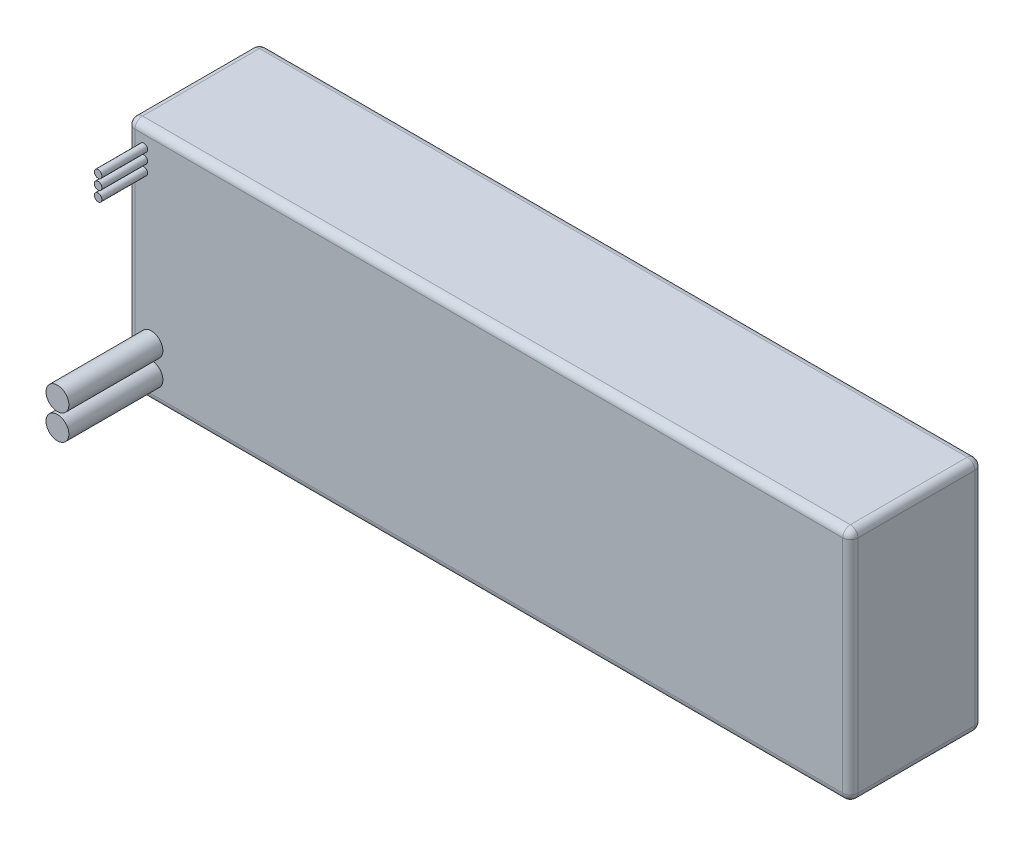
ISO-10303-21;
HEADER;
FILE_DESCRIPTION(('STEP AP214'),'2;1');
FILE_NAME('part.step','',(''),(''),'','','');
FILE_SCHEMA(('AUTOMOTIVE_DESIGN { 1 0 10303 214 1 1 1 1 }'));
ENDSEC;
DATA;
#1=APPLICATION_CONTEXT('core data for automotive mechanical design processes');
#2=APPLICATION_PROTOCOL_DEFINITION('international standard','automotive_design',2000,#1);
#3=PRODUCT_CONTEXT('',#1,'mechanical');
#4=PRODUCT('Part','Part','',(#3));
#5=PRODUCT_RELATED_PRODUCT_CATEGORY('part','',(#4));
#6=PRODUCT_DEFINITION_FORMATION('','',#4);
#7=PRODUCT_DEFINITION_CONTEXT('part definition',#1,'design');
#8=PRODUCT_DEFINITION('design','',#6,#7);
#9=PRODUCT_DEFINITION_SHAPE('','',#8);
#10=(LENGTH_UNIT() NAMED_UNIT(*) SI_UNIT(.MILLI.,.METRE.));
#11=(NAMED_UNIT(*) PLANE_ANGLE_UNIT() SI_UNIT($,.RADIAN.));
#12=(NAMED_UNIT(*) SI_UNIT($,.STERADIAN.) SOLID_ANGLE_UNIT());
#13=UNCERTAINTY_MEASURE_WITH_UNIT(LENGTH_MEASURE(1.E-05),#10,'distance_accuracy_value','');
#14=(GEOMETRIC_REPRESENTATION_CONTEXT(3) GLOBAL_UNCERTAINTY_ASSIGNED_CONTEXT((#13)) GLOBAL_UNIT_ASSIGNED_CONTEXT((#10,
#11,#12)) REPRESENTATION_CONTEXT('',''));
#15=CARTESIAN_POINT('',(0.,0.,0.));
#16=DIRECTION('',(0.,0.,1.));
#17=DIRECTION('',(1.,0.,0.));
#18=AXIS2_PLACEMENT_3D('',#15,#16,#17);
#19=CARTESIAN_POINT('',(-71.15,-23.25,-13.));
#20=DIRECTION('',(-1.,0.,0.));
#21=DIRECTION('',(0.,0.,1.));
#22=AXIS2_PLACEMENT_3D('',#19,#20,#21);
#23=PLANE('',#22);
#24=DIRECTION('',(0.,0.,1.));
#25=VECTOR('',#24,1.);
#26=CARTESIAN_POINT('',(-71.15,21.75,-13.));
#27=LINE('',#26,#25);
#28=CARTESIAN_POINT('',(-71.15,21.75,11.5));
#29=VERTEX_POINT('',#28);
#30=CARTESIAN_POINT('',(-71.15,21.75,-11.5));
#31=VERTEX_POINT('',#30);
#32=EDGE_CURVE('E136',#29,#31,#27,.F.);
#33=ORIENTED_EDGE('',*,*,#32,.T.);
#34=DIRECTION('',(0.,-1.,0.));
#35=VECTOR('',#34,1.);
#36=CARTESIAN_POINT('',(-71.15,-23.25,-11.5));
#37=LINE('',#36,#35);
#38=CARTESIAN_POINT('',(-71.15,-21.75,-11.5));
#39=VERTEX_POINT('',#38);
#40=EDGE_CURVE('E132',#31,#39,#37,.T.);
#41=ORIENTED_EDGE('',*,*,#40,.T.);
#42=DIRECTION('',(0.,0.,1.));
#43=VECTOR('',#42,1.);
#44=CARTESIAN_POINT('',(-71.15,-21.75,-13.));
#45=LINE('',#44,#43);
#46=CARTESIAN_POINT('',(-71.15,-21.75,11.5));
#47=VERTEX_POINT('',#46);
#48=EDGE_CURVE('E127',#39,#47,#45,.T.);
#49=ORIENTED_EDGE('',*,*,#48,.T.);
#50=DIRECTION('',(0.,-1.,0.));
#51=VECTOR('',#50,1.);
#52=CARTESIAN_POINT('',(-71.15,23.25,11.5));
#53=LINE('',#52,#51);
#54=EDGE_CURVE('E129',#47,#29,#53,.F.);
#55=ORIENTED_EDGE('',*,*,#54,.T.);
#56=EDGE_LOOP('',(#33,#41,#49,#55));
#57=FACE_BOUND('',#56,.T.);
#58=ADVANCED_FACE('F39',(#57),#23,.T.);
#59=CARTESIAN_POINT('',(-71.15,23.25,-13.));
#60=DIRECTION('',(0.,1.,0.));
#61=DIRECTION('',(0.,0.,1.));
#62=AXIS2_PLACEMENT_3D('',#59,#60,#61);
#63=PLANE('',#62);
#64=DIRECTION('',(0.,0.,1.));
#65=VECTOR('',#64,1.);
#66=CARTESIAN_POINT('',(69.65,23.25,-13.));
#67=LINE('',#66,#65);
#68=CARTESIAN_POINT('',(69.65,23.25,11.5));
#69=VERTEX_POINT('',#68);
#70=CARTESIAN_POINT('',(69.65,23.25,-11.5));
#71=VERTEX_POINT('',#70);
#72=EDGE_CURVE('E394',#69,#71,#67,.F.);
#73=ORIENTED_EDGE('',*,*,#72,.T.);
#74=DIRECTION('',(-1.,0.,0.));
#75=VECTOR('',#74,1.);
#76=CARTESIAN_POINT('',(-71.15,23.25,-11.5));
#77=LINE('',#76,#75);
#78=CARTESIAN_POINT('',(-69.65,23.25,-11.5));
#79=VERTEX_POINT('',#78);
#80=EDGE_CURVE('E396',#71,#79,#77,.T.);
#81=ORIENTED_EDGE('',*,*,#80,.T.);
#82=DIRECTION('',(0.,0.,1.));
#83=VECTOR('',#82,1.);
#84=CARTESIAN_POINT('',(-69.65,23.25,-13.));
#85=LINE('',#84,#83);
#86=CARTESIAN_POINT('',(-69.65,23.25,11.5));
#87=VERTEX_POINT('',#86);
#88=EDGE_CURVE('E392',#79,#87,#85,.T.);
#89=ORIENTED_EDGE('',*,*,#88,.T.);
#90=DIRECTION('',(-1.,0.,0.));
#91=VECTOR('',#90,1.);
#92=CARTESIAN_POINT('',(71.15,23.25,11.5));
#93=LINE('',#92,#91);
#94=EDGE_CURVE('E390',#87,#69,#93,.F.);
#95=ORIENTED_EDGE('',*,*,#94,.T.);
#96=EDGE_LOOP('',(#73,#81,#89,#95));
#97=FACE_BOUND('',#96,.T.);
#98=ADVANCED_FACE('F248',(#97),#63,.T.);
#99=CARTESIAN_POINT('',(71.15,-23.25,-13.));
#100=DIRECTION('',(1.,0.,0.));
#101=DIRECTION('',(0.,0.,-1.));
#102=AXIS2_PLACEMENT_3D('',#99,#100,#101);
#103=PLANE('',#102);
#104=DIRECTION('',(0.,0.,1.));
#105=VECTOR('',#104,1.);
#106=CARTESIAN_POINT('',(71.15,-21.75,-13.));
#107=LINE('',#106,#105);
#108=CARTESIAN_POINT('',(71.15,-21.75,11.5));
#109=VERTEX_POINT('',#108);
#110=CARTESIAN_POINT('',(71.15,-21.75,-11.5));
#111=VERTEX_POINT('',#110);
#112=EDGE_CURVE('E385',#109,#111,#107,.F.);
#113=ORIENTED_EDGE('',*,*,#112,.T.);
#114=DIRECTION('',(0.,1.,0.));
#115=VECTOR('',#114,1.);
#116=CARTESIAN_POINT('',(71.15,-23.25,-11.5));
#117=LINE('',#116,#115);
#118=CARTESIAN_POINT('',(71.15,21.75,-11.5));
#119=VERTEX_POINT('',#118);
#120=EDGE_CURVE('E387',#111,#119,#117,.T.);
#121=ORIENTED_EDGE('',*,*,#120,.T.);
#122=DIRECTION('',(0.,0.,1.));
#123=VECTOR('',#122,1.);
#124=CARTESIAN_POINT('',(71.15,21.75,-13.));
#125=LINE('',#124,#123);
#126=CARTESIAN_POINT('',(71.15,21.75,11.5));
#127=VERTEX_POINT('',#126);
#128=EDGE_CURVE('E383',#119,#127,#125,.T.);
#129=ORIENTED_EDGE('',*,*,#128,.T.);
#130=DIRECTION('',(0.,1.,0.));
#131=VECTOR('',#130,1.);
#132=CARTESIAN_POINT('',(71.15,-23.25,11.5));
#133=LINE('',#132,#131);
#134=EDGE_CURVE('E381',#127,#109,#133,.F.);
#135=ORIENTED_EDGE('',*,*,#134,.T.);
#136=EDGE_LOOP('',(#113,#121,#129,#135));
#137=FACE_BOUND('',#136,.T.);
#138=ADVANCED_FACE('F253',(#137),#103,.T.);
#139=CARTESIAN_POINT('',(-71.15,-23.25,-13.));
#140=DIRECTION('',(0.,-1.,0.));
#141=DIRECTION('',(0.,0.,-1.));
#142=AXIS2_PLACEMENT_3D('',#139,#140,#141);
#143=PLANE('',#142);
#144=DIRECTION('',(0.,0.,1.));
#145=VECTOR('',#144,1.);
#146=CARTESIAN_POINT('',(-69.65,-23.25,-13.));
#147=LINE('',#146,#145);
#148=CARTESIAN_POINT('',(-69.65,-23.25,11.5));
#149=VERTEX_POINT('',#148);
#150=CARTESIAN_POINT('',(-69.65,-23.25,-11.5));
#151=VERTEX_POINT('',#150);
#152=EDGE_CURVE('E158',#149,#151,#147,.F.);
#153=ORIENTED_EDGE('',*,*,#152,.T.);
#154=DIRECTION('',(1.,0.,0.));
#155=VECTOR('',#154,1.);
#156=CARTESIAN_POINT('',(-71.15,-23.25,-11.5));
#157=LINE('',#156,#155);
#158=CARTESIAN_POINT('',(69.65,-23.25,-11.5));
#159=VERTEX_POINT('',#158);
#160=EDGE_CURVE('E378',#151,#159,#157,.T.);
#161=ORIENTED_EDGE('',*,*,#160,.T.);
#162=DIRECTION('',(0.,0.,1.));
#163=VECTOR('',#162,1.);
#164=CARTESIAN_POINT('',(69.65,-23.25,-13.));
#165=LINE('',#164,#163);
#166=CARTESIAN_POINT('',(69.65,-23.25,11.5));
#167=VERTEX_POINT('',#166);
#168=EDGE_CURVE('E371',#159,#167,#165,.T.);
#169=ORIENTED_EDGE('',*,*,#168,.T.);
#170=DIRECTION('',(1.,0.,0.));
#171=VECTOR('',#170,1.);
#172=CARTESIAN_POINT('',(-71.15,-23.25,11.5));
#173=LINE('',#172,#171);
#174=EDGE_CURVE('E369',#167,#149,#173,.F.);
#175=ORIENTED_EDGE('',*,*,#174,.T.);
#176=EDGE_LOOP('',(#153,#161,#169,#175));
#177=FACE_BOUND('',#176,.T.);
#178=ADVANCED_FACE('F257',(#177),#143,.T.);
#179=CARTESIAN_POINT('',(0.,0.,-13.));
#180=DIRECTION('',(0.,0.,-1.));
#181=DIRECTION('',(-1.,0.,0.));
#182=AXIS2_PLACEMENT_3D('',#179,#180,#181);
#183=PLANE('',#182);
#184=DIRECTION('',(1.,0.,0.));
#185=VECTOR('',#184,1.);
#186=CARTESIAN_POINT('',(0.,-21.75,-13.));
#187=LINE('',#186,#185);
#188=CARTESIAN_POINT('',(69.65,-21.75,-13.));
#189=VERTEX_POINT('',#188);
#190=CARTESIAN_POINT('',(-69.65,-21.75,-13.));
#191=VERTEX_POINT('',#190);
#192=EDGE_CURVE('E366',#189,#191,#187,.F.);
#193=ORIENTED_EDGE('',*,*,#192,.T.);
#194=DIRECTION('',(0.,-1.,0.));
#195=VECTOR('',#194,1.);
#196=CARTESIAN_POINT('',(-69.65,0.,-13.));
#197=LINE('',#196,#195);
#198=CARTESIAN_POINT('',(-69.65,21.75,-13.));
#199=VERTEX_POINT('',#198);
#200=EDGE_CURVE('E364',#191,#199,#197,.F.);
#201=ORIENTED_EDGE('',*,*,#200,.T.);
#202=DIRECTION('',(-1.,0.,0.));
#203=VECTOR('',#202,1.);
#204=CARTESIAN_POINT('',(0.,21.75,-13.));
#205=LINE('',#204,#203);
#206=CARTESIAN_POINT('',(69.65,21.75,-13.));
#207=VERTEX_POINT('',#206);
#208=EDGE_CURVE('E356',#199,#207,#205,.F.);
#209=ORIENTED_EDGE('',*,*,#208,.T.);
#210=DIRECTION('',(0.,1.,0.));
#211=VECTOR('',#210,1.);
#212=CARTESIAN_POINT('',(69.65,0.,-13.));
#213=LINE('',#212,#211);
#214=EDGE_CURVE('E361',#207,#189,#213,.F.);
#215=ORIENTED_EDGE('',*,*,#214,.T.);
#216=EDGE_LOOP('',(#193,#201,#209,#215));
#217=FACE_BOUND('',#216,.T.);
#218=ADVANCED_FACE('F221',(#217),#183,.T.);
#219=CARTESIAN_POINT('',(0.,0.,13.));
#220=DIRECTION('',(0.,0.,-1.));
#221=DIRECTION('',(-1.,0.,0.));
#222=AXIS2_PLACEMENT_3D('',#219,#220,#221);
#223=PLANE('',#222);
#224=CARTESIAN_POINT('',(-67.9,15.5,13.));
#225=DIRECTION('',(0.,0.,-1.));
#226=DIRECTION('',(-1.,0.,0.));
#227=AXIS2_PLACEMENT_3D('',#224,#225,#226);
#228=CIRCLE('',#227,0.749999999999999);
#229=CARTESIAN_POINT('',(-68.65,15.5,13.));
#230=VERTEX_POINT('',#229);
#231=EDGE_CURVE('E11',#230,#230,#228,.F.);
#232=ORIENTED_EDGE('',*,*,#231,.F.);
#233=EDGE_LOOP('',(#232));
#234=FACE_BOUND('',#233,.T.);
#235=CARTESIAN_POINT('',(-67.9,17.5,13.));
#236=DIRECTION('',(0.,0.,-1.));
#237=DIRECTION('',(-1.,0.,0.));
#238=AXIS2_PLACEMENT_3D('',#235,#236,#237);
#239=CIRCLE('',#238,0.749999999999999);
#240=CARTESIAN_POINT('',(-68.65,17.5,13.));
#241=VERTEX_POINT('',#240);
#242=EDGE_CURVE('E47',#241,#241,#239,.F.);
#243=ORIENTED_EDGE('',*,*,#242,.F.);
#244=EDGE_LOOP('',(#243));
#245=FACE_BOUND('',#244,.T.);
#246=CARTESIAN_POINT('',(-67.9,19.5,13.));
#247=DIRECTION('',(0.,0.,-1.));
#248=DIRECTION('',(-1.,0.,0.));
#249=AXIS2_PLACEMENT_3D('',#246,#247,#248);
#250=CIRCLE('',#249,0.749999999999999);
#251=CARTESIAN_POINT('',(-68.65,19.5,13.));
#252=VERTEX_POINT('',#251);
#253=EDGE_CURVE('E211',#252,#252,#250,.F.);
#254=ORIENTED_EDGE('',*,*,#253,.F.);
#255=EDGE_LOOP('',(#254));
#256=FACE_BOUND('',#255,.T.);
#257=CARTESIAN_POINT('',(-66.4,-13.25,13.));
#258=DIRECTION('',(0.,0.,-1.));
#259=DIRECTION('',(-1.,0.,0.));
#260=AXIS2_PLACEMENT_3D('',#257,#258,#259);
#261=CIRCLE('',#260,2.25);
#262=CARTESIAN_POINT('',(-68.65,-13.25,13.));
#263=VERTEX_POINT('',#262);
#264=EDGE_CURVE('E207',#263,#263,#261,.F.);
#265=ORIENTED_EDGE('',*,*,#264,.F.);
#266=EDGE_LOOP('',(#265));
#267=FACE_BOUND('',#266,.T.);
#268=CARTESIAN_POINT('',(-66.4,-18.25,13.));
#269=DIRECTION('',(0.,0.,-1.));
#270=DIRECTION('',(-1.,0.,0.));
#271=AXIS2_PLACEMENT_3D('',#268,#269,#270);
#272=CIRCLE('',#271,2.25);
#273=CARTESIAN_POINT('',(-68.65,-18.25,13.));
#274=VERTEX_POINT('',#273);
#275=EDGE_CURVE('E204',#274,#274,#272,.F.);
#276=ORIENTED_EDGE('',*,*,#275,.F.);
#277=EDGE_LOOP('',(#276));
#278=FACE_BOUND('',#277,.T.);
#279=DIRECTION('',(0.,1.,0.));
#280=VECTOR('',#279,1.);
#281=CARTESIAN_POINT('',(69.65,23.25,13.));
#282=LINE('',#281,#280);
#283=CARTESIAN_POINT('',(69.65,-21.75,13.));
#284=VERTEX_POINT('',#283);
#285=CARTESIAN_POINT('',(69.65,21.75,13.));
#286=VERTEX_POINT('',#285);
#287=EDGE_CURVE('E54',#284,#286,#282,.T.);
#288=ORIENTED_EDGE('',*,*,#287,.T.);
#289=DIRECTION('',(-1.,0.,0.));
#290=VECTOR('',#289,1.);
#291=CARTESIAN_POINT('',(-71.15,21.75,13.));
#292=LINE('',#291,#290);
#293=CARTESIAN_POINT('',(-69.65,21.75,13.));
#294=VERTEX_POINT('',#293);
#295=EDGE_CURVE('E208',#286,#294,#292,.T.);
#296=ORIENTED_EDGE('',*,*,#295,.T.);
#297=DIRECTION('',(0.,-1.,0.));
#298=VECTOR('',#297,1.);
#299=CARTESIAN_POINT('',(-69.65,-23.25,13.));
#300=LINE('',#299,#298);
#301=CARTESIAN_POINT('',(-69.65,-21.75,13.));
#302=VERTEX_POINT('',#301);
#303=EDGE_CURVE('E399',#294,#302,#300,.T.);
#304=ORIENTED_EDGE('',*,*,#303,.T.);
#305=DIRECTION('',(1.,0.,0.));
#306=VECTOR('',#305,1.);
#307=CARTESIAN_POINT('',(71.15,-21.75,13.));
#308=LINE('',#307,#306);
#309=EDGE_CURVE('E59',#302,#284,#308,.T.);
#310=ORIENTED_EDGE('',*,*,#309,.T.);
#311=EDGE_LOOP('',(#288,#296,#304,#310));
#312=FACE_BOUND('',#311,.T.);
#313=ADVANCED_FACE('F218',(#234,#245,#256,#267,#278,#312),#223,.F.);
#314=CARTESIAN_POINT('',(69.65,0.,11.5));
#315=DIRECTION('',(0.,-1.,0.));
#316=DIRECTION('',(0.,0.,-1.));
#317=AXIS2_PLACEMENT_3D('',#314,#315,#316);
#318=CYLINDRICAL_SURFACE('',#317,1.5);
#319=CARTESIAN_POINT('',(69.65,21.75,11.5));
#320=DIRECTION('',(0.,1.,0.));
#321=DIRECTION('',(0.,0.,1.));
#322=AXIS2_PLACEMENT_3D('',#319,#320,#321);
#323=CIRCLE('',#322,1.5);
#324=EDGE_CURVE('E147',#286,#127,#323,.T.);
#325=ORIENTED_EDGE('',*,*,#324,.F.);
#326=ORIENTED_EDGE('',*,*,#287,.F.);
#327=CARTESIAN_POINT('',(69.65,-21.75,11.5));
#328=DIRECTION('',(0.,-1.,0.));
#329=DIRECTION('',(0.,0.,-1.));
#330=AXIS2_PLACEMENT_3D('',#327,#328,#329);
#331=CIRCLE('',#330,1.5);
#332=EDGE_CURVE('E199',#109,#284,#331,.T.);
#333=ORIENTED_EDGE('',*,*,#332,.F.);
#334=ORIENTED_EDGE('',*,*,#134,.F.);
#335=EDGE_LOOP('',(#325,#326,#333,#334));
#336=FACE_BOUND('',#335,.T.);
#337=ADVANCED_FACE('F41',(#336),#318,.T.);
#338=CARTESIAN_POINT('',(69.65,21.75,11.5));
#339=DIRECTION('',(1.,0.,0.));
#340=DIRECTION('',(0.,0.,-1.));
#341=AXIS2_PLACEMENT_3D('',#338,#339,#340);
#342=SPHERICAL_SURFACE('',#341,1.5);
#343=CARTESIAN_POINT('',(69.65,21.75,11.5));
#344=DIRECTION('',(1.,0.,0.));
#345=DIRECTION('',(0.,0.,-1.));
#346=AXIS2_PLACEMENT_3D('',#343,#344,#345);
#347=CIRCLE('',#346,1.5);
#348=EDGE_CURVE('E193',#286,#69,#347,.F.);
#349=ORIENTED_EDGE('',*,*,#348,.F.);
#350=ORIENTED_EDGE('',*,*,#324,.T.);
#351=CARTESIAN_POINT('',(69.65,21.75,11.5));
#352=DIRECTION('',(0.,0.,1.));
#353=DIRECTION('',(1.,0.,0.));
#354=AXIS2_PLACEMENT_3D('',#351,#352,#353);
#355=CIRCLE('',#354,1.5);
#356=EDGE_CURVE('E196',#69,#127,#355,.F.);
#357=ORIENTED_EDGE('',*,*,#356,.F.);
#358=EDGE_LOOP('',(#349,#350,#357));
#359=FACE_BOUND('',#358,.T.);
#360=ADVANCED_FACE('F319',(#359),#342,.T.);
#361=CARTESIAN_POINT('',(69.65,-21.75,11.5));
#362=DIRECTION('',(0.,0.,1.));
#363=DIRECTION('',(1.,0.,0.));
#364=AXIS2_PLACEMENT_3D('',#361,#362,#363);
#365=SPHERICAL_SURFACE('',#364,1.5);
#366=CARTESIAN_POINT('',(69.65,-21.75,11.5));
#367=DIRECTION('',(0.,0.,1.));
#368=DIRECTION('',(1.,0.,0.));
#369=AXIS2_PLACEMENT_3D('',#366,#367,#368);
#370=CIRCLE('',#369,1.5);
#371=EDGE_CURVE('E187',#109,#167,#370,.F.);
#372=ORIENTED_EDGE('',*,*,#371,.F.);
#373=ORIENTED_EDGE('',*,*,#332,.T.);
#374=CARTESIAN_POINT('',(69.65,-21.75,11.5));
#375=DIRECTION('',(1.,0.,0.));
#376=DIRECTION('',(0.,0.,-1.));
#377=AXIS2_PLACEMENT_3D('',#374,#375,#376);
#378=CIRCLE('',#377,1.5);
#379=EDGE_CURVE('E190',#167,#284,#378,.F.);
#380=ORIENTED_EDGE('',*,*,#379,.F.);
#381=EDGE_LOOP('',(#372,#373,#380));
#382=FACE_BOUND('',#381,.T.);
#383=ADVANCED_FACE('F316',(#382),#365,.T.);
#384=CARTESIAN_POINT('',(69.65,21.75,-13.));
#385=DIRECTION('',(0.,0.,1.));
#386=DIRECTION('',(1.,0.,0.));
#387=AXIS2_PLACEMENT_3D('',#384,#385,#386);
#388=CYLINDRICAL_SURFACE('',#387,1.5);
#389=ORIENTED_EDGE('',*,*,#356,.T.);
#390=ORIENTED_EDGE('',*,*,#128,.F.);
#391=CARTESIAN_POINT('',(69.65,21.75,-11.5));
#392=DIRECTION('',(0.,0.,-1.));
#393=DIRECTION('',(-1.,0.,0.));
#394=AXIS2_PLACEMENT_3D('',#391,#392,#393);
#395=CIRCLE('',#394,1.5);
#396=EDGE_CURVE('E182',#71,#119,#395,.T.);
#397=ORIENTED_EDGE('',*,*,#396,.F.);
#398=ORIENTED_EDGE('',*,*,#72,.F.);
#399=EDGE_LOOP('',(#389,#390,#397,#398));
#400=FACE_BOUND('',#399,.T.);
#401=ADVANCED_FACE('F312',(#400),#388,.T.);
#402=CARTESIAN_POINT('',(0.,21.75,11.5));
#403=DIRECTION('',(1.,0.,0.));
#404=DIRECTION('',(0.,0.,-1.));
#405=AXIS2_PLACEMENT_3D('',#402,#403,#404);
#406=CYLINDRICAL_SURFACE('',#405,1.5);
#407=ORIENTED_EDGE('',*,*,#348,.T.);
#408=ORIENTED_EDGE('',*,*,#94,.F.);
#409=CARTESIAN_POINT('',(-69.65,21.75,11.5));
#410=DIRECTION('',(-1.,0.,0.));
#411=DIRECTION('',(0.,0.,1.));
#412=AXIS2_PLACEMENT_3D('',#409,#410,#411);
#413=CIRCLE('',#412,1.5);
#414=EDGE_CURVE('E179',#294,#87,#413,.T.);
#415=ORIENTED_EDGE('',*,*,#414,.F.);
#416=ORIENTED_EDGE('',*,*,#295,.F.);
#417=EDGE_LOOP('',(#407,#408,#415,#416));
#418=FACE_BOUND('',#417,.T.);
#419=ADVANCED_FACE('F309',(#418),#406,.T.);
#420=CARTESIAN_POINT('',(-69.65,0.,11.5));
#421=DIRECTION('',(0.,1.,0.));
#422=DIRECTION('',(0.,0.,1.));
#423=AXIS2_PLACEMENT_3D('',#420,#421,#422);
#424=CYLINDRICAL_SURFACE('',#423,1.5);
#425=CARTESIAN_POINT('',(-69.65,-21.75,11.5));
#426=DIRECTION('',(0.,-1.,0.));
#427=DIRECTION('',(0.,0.,-1.));
#428=AXIS2_PLACEMENT_3D('',#425,#426,#427);
#429=CIRCLE('',#428,1.5);
#430=EDGE_CURVE('E143',#302,#47,#429,.T.);
#431=ORIENTED_EDGE('',*,*,#430,.F.);
#432=ORIENTED_EDGE('',*,*,#303,.F.);
#433=CARTESIAN_POINT('',(-69.65,21.75,11.5));
#434=DIRECTION('',(0.,1.,0.));
#435=DIRECTION('',(0.,0.,1.));
#436=AXIS2_PLACEMENT_3D('',#433,#434,#435);
#437=CIRCLE('',#436,1.5);
#438=EDGE_CURVE('E145',#29,#294,#437,.T.);
#439=ORIENTED_EDGE('',*,*,#438,.F.);
#440=ORIENTED_EDGE('',*,*,#54,.F.);
#441=EDGE_LOOP('',(#431,#432,#439,#440));
#442=FACE_BOUND('',#441,.T.);
#443=ADVANCED_FACE('F141',(#442),#424,.T.);
#444=CARTESIAN_POINT('',(0.,-21.75,11.5));
#445=DIRECTION('',(-1.,0.,0.));
#446=DIRECTION('',(0.,0.,1.));
#447=AXIS2_PLACEMENT_3D('',#444,#445,#446);
#448=CYLINDRICAL_SURFACE('',#447,1.5);
#449=ORIENTED_EDGE('',*,*,#379,.T.);
#450=ORIENTED_EDGE('',*,*,#309,.F.);
#451=CARTESIAN_POINT('',(-69.65,-21.75,11.5));
#452=DIRECTION('',(-1.,0.,0.));
#453=DIRECTION('',(0.,0.,1.));
#454=AXIS2_PLACEMENT_3D('',#451,#452,#453);
#455=CIRCLE('',#454,1.5);
#456=EDGE_CURVE('E155',#149,#302,#455,.T.);
#457=ORIENTED_EDGE('',*,*,#456,.F.);
#458=ORIENTED_EDGE('',*,*,#174,.F.);
#459=EDGE_LOOP('',(#449,#450,#457,#458));
#460=FACE_BOUND('',#459,.T.);
#461=ADVANCED_FACE('F302',(#460),#448,.T.);
#462=CARTESIAN_POINT('',(69.65,-21.75,-13.));
#463=DIRECTION('',(0.,0.,1.));
#464=DIRECTION('',(1.,0.,0.));
#465=AXIS2_PLACEMENT_3D('',#462,#463,#464);
#466=CYLINDRICAL_SURFACE('',#465,1.5);
#467=ORIENTED_EDGE('',*,*,#371,.T.);
#468=ORIENTED_EDGE('',*,*,#168,.F.);
#469=CARTESIAN_POINT('',(69.65,-21.75,-11.5));
#470=DIRECTION('',(0.,0.,-1.));
#471=DIRECTION('',(-1.,0.,0.));
#472=AXIS2_PLACEMENT_3D('',#469,#470,#471);
#473=CIRCLE('',#472,1.5);
#474=EDGE_CURVE('E174',#111,#159,#473,.T.);
#475=ORIENTED_EDGE('',*,*,#474,.F.);
#476=ORIENTED_EDGE('',*,*,#112,.F.);
#477=EDGE_LOOP('',(#467,#468,#475,#476));
#478=FACE_BOUND('',#477,.T.);
#479=ADVANCED_FACE('F298',(#478),#466,.T.);
#480=CARTESIAN_POINT('',(69.65,-23.25,-11.5));
#481=DIRECTION('',(0.,1.,0.));
#482=DIRECTION('',(0.,0.,1.));
#483=AXIS2_PLACEMENT_3D('',#480,#481,#482);
#484=CYLINDRICAL_SURFACE('',#483,1.5);
#485=CARTESIAN_POINT('',(69.65,21.75,-11.5));
#486=DIRECTION('',(0.,1.,0.));
#487=DIRECTION('',(0.,0.,1.));
#488=AXIS2_PLACEMENT_3D('',#485,#486,#487);
#489=CIRCLE('',#488,1.5);
#490=EDGE_CURVE('E184',#119,#207,#489,.T.);
#491=ORIENTED_EDGE('',*,*,#490,.F.);
#492=ORIENTED_EDGE('',*,*,#120,.F.);
#493=CARTESIAN_POINT('',(69.65,-21.75,-11.5));
#494=DIRECTION('',(0.,-1.,0.));
#495=DIRECTION('',(0.,0.,-1.));
#496=AXIS2_PLACEMENT_3D('',#493,#494,#495);
#497=CIRCLE('',#496,1.5);
#498=EDGE_CURVE('E171',#189,#111,#497,.T.);
#499=ORIENTED_EDGE('',*,*,#498,.F.);
#500=ORIENTED_EDGE('',*,*,#214,.F.);
#501=EDGE_LOOP('',(#491,#492,#499,#500));
#502=FACE_BOUND('',#501,.T.);
#503=ADVANCED_FACE('F294',(#502),#484,.T.);
#504=CARTESIAN_POINT('',(69.65,21.75,-11.5));
#505=DIRECTION('',(1.,0.,0.));
#506=DIRECTION('',(0.,0.,-1.));
#507=AXIS2_PLACEMENT_3D('',#504,#505,#506);
#508=SPHERICAL_SURFACE('',#507,1.5);
#509=ORIENTED_EDGE('',*,*,#396,.T.);
#510=ORIENTED_EDGE('',*,*,#490,.T.);
#511=CARTESIAN_POINT('',(69.65,21.75,-11.5));
#512=DIRECTION('',(1.,0.,0.));
#513=DIRECTION('',(0.,0.,-1.));
#514=AXIS2_PLACEMENT_3D('',#511,#512,#513);
#515=CIRCLE('',#514,1.5);
#516=EDGE_CURVE('E163',#71,#207,#515,.F.);
#517=ORIENTED_EDGE('',*,*,#516,.F.);
#518=EDGE_LOOP('',(#509,#510,#517));
#519=FACE_BOUND('',#518,.T.);
#520=ADVANCED_FACE('F290',(#519),#508,.T.);
#521=CARTESIAN_POINT('',(-69.65,21.75,11.5));
#522=DIRECTION('',(0.,0.,1.));
#523=DIRECTION('',(1.,0.,0.));
#524=AXIS2_PLACEMENT_3D('',#521,#522,#523);
#525=SPHERICAL_SURFACE('',#524,1.5);
#526=ORIENTED_EDGE('',*,*,#438,.T.);
#527=ORIENTED_EDGE('',*,*,#414,.T.);
#528=CARTESIAN_POINT('',(-69.65,21.75,11.5));
#529=DIRECTION('',(0.,0.,1.));
#530=DIRECTION('',(1.,0.,0.));
#531=AXIS2_PLACEMENT_3D('',#528,#529,#530);
#532=CIRCLE('',#531,1.5);
#533=EDGE_CURVE('E159',#29,#87,#532,.F.);
#534=ORIENTED_EDGE('',*,*,#533,.F.);
#535=EDGE_LOOP('',(#526,#527,#534));
#536=FACE_BOUND('',#535,.T.);
#537=ADVANCED_FACE('F287',(#536),#525,.T.);
#538=CARTESIAN_POINT('',(-69.65,-21.75,11.5));
#539=DIRECTION('',(0.,0.,1.));
#540=DIRECTION('',(1.,0.,0.));
#541=AXIS2_PLACEMENT_3D('',#538,#539,#540);
#542=SPHERICAL_SURFACE('',#541,1.5);
#543=ORIENTED_EDGE('',*,*,#456,.T.);
#544=ORIENTED_EDGE('',*,*,#430,.T.);
#545=CARTESIAN_POINT('',(-69.65,-21.75,11.5));
#546=DIRECTION('',(0.,0.,1.));
#547=DIRECTION('',(1.,0.,0.));
#548=AXIS2_PLACEMENT_3D('',#545,#546,#547);
#549=CIRCLE('',#548,1.5);
#550=EDGE_CURVE('E152',#149,#47,#549,.F.);
#551=ORIENTED_EDGE('',*,*,#550,.F.);
#552=EDGE_LOOP('',(#543,#544,#551));
#553=FACE_BOUND('',#552,.T.);
#554=ADVANCED_FACE('F151',(#553),#542,.T.);
#555=CARTESIAN_POINT('',(69.65,-21.75,-11.5));
#556=DIRECTION('',(1.,0.,0.));
#557=DIRECTION('',(0.,0.,-1.));
#558=AXIS2_PLACEMENT_3D('',#555,#556,#557);
#559=SPHERICAL_SURFACE('',#558,1.5);
#560=ORIENTED_EDGE('',*,*,#498,.T.);
#561=ORIENTED_EDGE('',*,*,#474,.T.);
#562=CARTESIAN_POINT('',(69.65,-21.75,-11.5));
#563=DIRECTION('',(1.,0.,0.));
#564=DIRECTION('',(0.,0.,-1.));
#565=AXIS2_PLACEMENT_3D('',#562,#563,#564);
#566=CIRCLE('',#565,1.5);
#567=EDGE_CURVE('E160',#189,#159,#566,.F.);
#568=ORIENTED_EDGE('',*,*,#567,.F.);
#569=EDGE_LOOP('',(#560,#561,#568));
#570=FACE_BOUND('',#569,.T.);
#571=ADVANCED_FACE('F280',(#570),#559,.T.);
#572=CARTESIAN_POINT('',(-71.15,21.75,-11.5));
#573=DIRECTION('',(-1.,0.,0.));
#574=DIRECTION('',(0.,0.,1.));
#575=AXIS2_PLACEMENT_3D('',#572,#573,#574);
#576=CYLINDRICAL_SURFACE('',#575,1.5);
#577=ORIENTED_EDGE('',*,*,#516,.T.);
#578=ORIENTED_EDGE('',*,*,#208,.F.);
#579=CARTESIAN_POINT('',(-69.65,21.75,-11.5));
#580=DIRECTION('',(-1.,0.,0.));
#581=DIRECTION('',(0.,0.,1.));
#582=AXIS2_PLACEMENT_3D('',#579,#580,#581);
#583=CIRCLE('',#582,1.5);
#584=EDGE_CURVE('E165',#79,#199,#583,.T.);
#585=ORIENTED_EDGE('',*,*,#584,.F.);
#586=ORIENTED_EDGE('',*,*,#80,.F.);
#587=EDGE_LOOP('',(#577,#578,#585,#586));
#588=FACE_BOUND('',#587,.T.);
#589=ADVANCED_FACE('F276',(#588),#576,.T.);
#590=CARTESIAN_POINT('',(-69.65,21.75,-13.));
#591=DIRECTION('',(0.,0.,1.));
#592=DIRECTION('',(1.,0.,0.));
#593=AXIS2_PLACEMENT_3D('',#590,#591,#592);
#594=CYLINDRICAL_SURFACE('',#593,1.5);
#595=ORIENTED_EDGE('',*,*,#533,.T.);
#596=ORIENTED_EDGE('',*,*,#88,.F.);
#597=CARTESIAN_POINT('',(-69.65,21.75,-11.5));
#598=DIRECTION('',(0.,0.,-1.));
#599=DIRECTION('',(-1.,0.,0.));
#600=AXIS2_PLACEMENT_3D('',#597,#598,#599);
#601=CIRCLE('',#600,1.5);
#602=EDGE_CURVE('E348',#31,#79,#601,.T.);
#603=ORIENTED_EDGE('',*,*,#602,.F.);
#604=ORIENTED_EDGE('',*,*,#32,.F.);
#605=EDGE_LOOP('',(#595,#596,#603,#604));
#606=FACE_BOUND('',#605,.T.);
#607=ADVANCED_FACE('F273',(#606),#594,.T.);
#608=CARTESIAN_POINT('',(-69.65,-21.75,-13.));
#609=DIRECTION('',(0.,0.,1.));
#610=DIRECTION('',(1.,0.,0.));
#611=AXIS2_PLACEMENT_3D('',#608,#609,#610);
#612=CYLINDRICAL_SURFACE('',#611,1.5);
#613=ORIENTED_EDGE('',*,*,#550,.T.);
#614=ORIENTED_EDGE('',*,*,#48,.F.);
#615=CARTESIAN_POINT('',(-69.65,-21.75,-11.5));
#616=DIRECTION('',(0.,0.,-1.));
#617=DIRECTION('',(-1.,0.,0.));
#618=AXIS2_PLACEMENT_3D('',#615,#616,#617);
#619=CIRCLE('',#618,1.5);
#620=EDGE_CURVE('E345',#151,#39,#619,.T.);
#621=ORIENTED_EDGE('',*,*,#620,.F.);
#622=ORIENTED_EDGE('',*,*,#152,.F.);
#623=EDGE_LOOP('',(#613,#614,#621,#622));
#624=FACE_BOUND('',#623,.T.);
#625=ADVANCED_FACE('F157',(#624),#612,.T.);
#626=CARTESIAN_POINT('',(-71.15,-21.75,-11.5));
#627=DIRECTION('',(1.,0.,0.));
#628=DIRECTION('',(0.,0.,-1.));
#629=AXIS2_PLACEMENT_3D('',#626,#627,#628);
#630=CYLINDRICAL_SURFACE('',#629,1.5);
#631=ORIENTED_EDGE('',*,*,#567,.T.);
#632=ORIENTED_EDGE('',*,*,#160,.F.);
#633=CARTESIAN_POINT('',(-69.65,-21.75,-11.5));
#634=DIRECTION('',(-1.,0.,0.));
#635=DIRECTION('',(0.,0.,1.));
#636=AXIS2_PLACEMENT_3D('',#633,#634,#635);
#637=CIRCLE('',#636,1.5);
#638=EDGE_CURVE('E342',#191,#151,#637,.T.);
#639=ORIENTED_EDGE('',*,*,#638,.F.);
#640=ORIENTED_EDGE('',*,*,#192,.F.);
#641=EDGE_LOOP('',(#631,#632,#639,#640));
#642=FACE_BOUND('',#641,.T.);
#643=ADVANCED_FACE('F266',(#642),#630,.T.);
#644=CARTESIAN_POINT('',(-69.65,21.75,-11.5));
#645=DIRECTION('',(0.,1.,0.));
#646=DIRECTION('',(0.,0.,1.));
#647=AXIS2_PLACEMENT_3D('',#644,#645,#646);
#648=SPHERICAL_SURFACE('',#647,1.5);
#649=ORIENTED_EDGE('',*,*,#602,.T.);
#650=ORIENTED_EDGE('',*,*,#584,.T.);
#651=CARTESIAN_POINT('',(-69.65,21.75,-11.5));
#652=DIRECTION('',(0.,1.,0.));
#653=DIRECTION('',(0.,0.,1.));
#654=AXIS2_PLACEMENT_3D('',#651,#652,#653);
#655=CIRCLE('',#654,1.5);
#656=EDGE_CURVE('E339',#31,#199,#655,.F.);
#657=ORIENTED_EDGE('',*,*,#656,.F.);
#658=EDGE_LOOP('',(#649,#650,#657));
#659=FACE_BOUND('',#658,.T.);
#660=ADVANCED_FACE('F262',(#659),#648,.T.);
#661=CARTESIAN_POINT('',(-69.65,-21.75,-11.5));
#662=DIRECTION('',(0.,-1.,0.));
#663=DIRECTION('',(0.,0.,-1.));
#664=AXIS2_PLACEMENT_3D('',#661,#662,#663);
#665=SPHERICAL_SURFACE('',#664,1.5);
#666=ORIENTED_EDGE('',*,*,#638,.T.);
#667=ORIENTED_EDGE('',*,*,#620,.T.);
#668=CARTESIAN_POINT('',(-69.65,-21.75,-11.5));
#669=DIRECTION('',(0.,-1.,0.));
#670=DIRECTION('',(0.,0.,-1.));
#671=AXIS2_PLACEMENT_3D('',#668,#669,#670);
#672=CIRCLE('',#671,1.5);
#673=EDGE_CURVE('E337',#191,#39,#672,.F.);
#674=ORIENTED_EDGE('',*,*,#673,.F.);
#675=EDGE_LOOP('',(#666,#667,#674));
#676=FACE_BOUND('',#675,.T.);
#677=ADVANCED_FACE('F243',(#676),#665,.T.);
#678=CARTESIAN_POINT('',(-69.65,-23.25,-11.5));
#679=DIRECTION('',(0.,-1.,0.));
#680=DIRECTION('',(0.,0.,-1.));
#681=AXIS2_PLACEMENT_3D('',#678,#679,#680);
#682=CYLINDRICAL_SURFACE('',#681,1.5);
#683=ORIENTED_EDGE('',*,*,#656,.T.);
#684=ORIENTED_EDGE('',*,*,#200,.F.);
#685=ORIENTED_EDGE('',*,*,#673,.T.);
#686=ORIENTED_EDGE('',*,*,#40,.F.);
#687=EDGE_LOOP('',(#683,#684,#685,#686));
#688=FACE_BOUND('',#687,.T.);
#689=ADVANCED_FACE('F233',(#688),#682,.T.);
#690=CARTESIAN_POINT('',(-66.4,-18.25,31.5));
#691=DIRECTION('',(0.,0.,-1.));
#692=DIRECTION('',(-1.,0.,0.));
#693=AXIS2_PLACEMENT_3D('',#690,#691,#692);
#694=CYLINDRICAL_SURFACE('',#693,2.25);
#695=CARTESIAN_POINT('',(-66.4,-18.25,31.5));
#696=DIRECTION('',(0.,0.,1.));
#697=DIRECTION('',(1.,0.,0.));
#698=AXIS2_PLACEMENT_3D('',#695,#696,#697);
#699=CIRCLE('',#698,2.25);
#700=CARTESIAN_POINT('',(-64.15,-18.25,31.5));
#701=VERTEX_POINT('',#700);
#702=EDGE_CURVE('E340',#701,#701,#699,.T.);
#703=ORIENTED_EDGE('',*,*,#702,.F.);
#704=EDGE_LOOP('',(#703));
#705=FACE_BOUND('',#704,.T.);
#706=ORIENTED_EDGE('',*,*,#275,.T.);
#707=EDGE_LOOP('',(#706));
#708=FACE_BOUND('',#707,.T.);
#709=ADVANCED_FACE('F230',(#705,#708),#694,.T.);
#710=CARTESIAN_POINT('',(-66.4,-18.25,31.5));
#711=DIRECTION('',(0.,0.,1.));
#712=DIRECTION('',(1.,0.,0.));
#713=AXIS2_PLACEMENT_3D('',#710,#711,#712);
#714=PLANE('',#713);
#715=ORIENTED_EDGE('',*,*,#702,.T.);
#716=EDGE_LOOP('',(#715));
#717=FACE_BOUND('',#716,.T.);
#718=ADVANCED_FACE('F232',(#717),#714,.T.);
#719=CARTESIAN_POINT('',(-66.4,-13.25,31.5));
#720=DIRECTION('',(0.,0.,-1.));
#721=DIRECTION('',(-1.,0.,0.));
#722=AXIS2_PLACEMENT_3D('',#719,#720,#721);
#723=CYLINDRICAL_SURFACE('',#722,2.25);
#724=CARTESIAN_POINT('',(-66.4,-13.25,31.5));
#725=DIRECTION('',(0.,0.,1.));
#726=DIRECTION('',(1.,0.,0.));
#727=AXIS2_PLACEMENT_3D('',#724,#725,#726);
#728=CIRCLE('',#727,2.25);
#729=CARTESIAN_POINT('',(-64.15,-13.25,31.5));
#730=VERTEX_POINT('',#729);
#731=EDGE_CURVE('E768',#730,#730,#728,.T.);
#732=ORIENTED_EDGE('',*,*,#731,.F.);
#733=EDGE_LOOP('',(#732));
#734=FACE_BOUND('',#733,.T.);
#735=ORIENTED_EDGE('',*,*,#264,.T.);
#736=EDGE_LOOP('',(#735));
#737=FACE_BOUND('',#736,.T.);
#738=ADVANCED_FACE('F240',(#734,#737),#723,.T.);
#739=CARTESIAN_POINT('',(-66.4,-13.25,31.5));
#740=DIRECTION('',(0.,0.,1.));
#741=DIRECTION('',(1.,0.,0.));
#742=AXIS2_PLACEMENT_3D('',#739,#740,#741);
#743=PLANE('',#742);
#744=ORIENTED_EDGE('',*,*,#731,.T.);
#745=EDGE_LOOP('',(#744));
#746=FACE_BOUND('',#745,.T.);
#747=ADVANCED_FACE('F602',(#746),#743,.T.);
#748=CARTESIAN_POINT('',(-67.9,19.5,22.));
#749=DIRECTION('',(0.,0.,-1.));
#750=DIRECTION('',(-1.,0.,0.));
#751=AXIS2_PLACEMENT_3D('',#748,#749,#750);
#752=CYLINDRICAL_SURFACE('',#751,0.749999999999999);
#753=CARTESIAN_POINT('',(-67.9,19.5,22.));
#754=DIRECTION('',(0.,0.,1.));
#755=DIRECTION('',(1.,0.,0.));
#756=AXIS2_PLACEMENT_3D('',#753,#754,#755);
#757=CIRCLE('',#756,0.749999999999999);
#758=CARTESIAN_POINT('',(-67.15,19.5,22.));
#759=VERTEX_POINT('',#758);
#760=EDGE_CURVE('E763',#759,#759,#757,.T.);
#761=ORIENTED_EDGE('',*,*,#760,.F.);
#762=EDGE_LOOP('',(#761));
#763=FACE_BOUND('',#762,.T.);
#764=ORIENTED_EDGE('',*,*,#253,.T.);
#765=EDGE_LOOP('',(#764));
#766=FACE_BOUND('',#765,.T.);
#767=ADVANCED_FACE('F612',(#763,#766),#752,.T.);
#768=CARTESIAN_POINT('',(-67.9,19.5,22.));
#769=DIRECTION('',(0.,0.,1.));
#770=DIRECTION('',(1.,0.,0.));
#771=AXIS2_PLACEMENT_3D('',#768,#769,#770);
#772=PLANE('',#771);
#773=ORIENTED_EDGE('',*,*,#760,.T.);
#774=EDGE_LOOP('',(#773));
#775=FACE_BOUND('',#774,.T.);
#776=ADVANCED_FACE('F622',(#775),#772,.T.);
#777=CARTESIAN_POINT('',(-67.9,17.5,22.));
#778=DIRECTION('',(0.,0.,-1.));
#779=DIRECTION('',(-1.,0.,0.));
#780=AXIS2_PLACEMENT_3D('',#777,#778,#779);
#781=CYLINDRICAL_SURFACE('',#780,0.749999999999999);
#782=CARTESIAN_POINT('',(-67.9,17.5,22.));
#783=DIRECTION('',(0.,0.,1.));
#784=DIRECTION('',(1.,0.,0.));
#785=AXIS2_PLACEMENT_3D('',#782,#783,#784);
#786=CIRCLE('',#785,0.749999999999999);
#787=CARTESIAN_POINT('',(-67.15,17.5,22.));
#788=VERTEX_POINT('',#787);
#789=EDGE_CURVE('E760',#788,#788,#786,.T.);
#790=ORIENTED_EDGE('',*,*,#789,.F.);
#791=EDGE_LOOP('',(#790));
#792=FACE_BOUND('',#791,.T.);
#793=ORIENTED_EDGE('',*,*,#242,.T.);
#794=EDGE_LOOP('',(#793));
#795=FACE_BOUND('',#794,.T.);
#796=ADVANCED_FACE('F216',(#792,#795),#781,.T.);
#797=CARTESIAN_POINT('',(-67.9,17.5,22.));
#798=DIRECTION('',(0.,0.,1.));
#799=DIRECTION('',(1.,0.,0.));
#800=AXIS2_PLACEMENT_3D('',#797,#798,#799);
#801=PLANE('',#800);
#802=ORIENTED_EDGE('',*,*,#789,.T.);
#803=EDGE_LOOP('',(#802));
#804=FACE_BOUND('',#803,.T.);
#805=ADVANCED_FACE('F641',(#804),#801,.T.);
#806=CARTESIAN_POINT('',(-67.9,15.5,22.));
#807=DIRECTION('',(0.,0.,-1.));
#808=DIRECTION('',(-1.,0.,0.));
#809=AXIS2_PLACEMENT_3D('',#806,#807,#808);
#810=CYLINDRICAL_SURFACE('',#809,0.749999999999999);
#811=CARTESIAN_POINT('',(-67.9,15.5,22.));
#812=DIRECTION('',(0.,0.,1.));
#813=DIRECTION('',(1.,0.,0.));
#814=AXIS2_PLACEMENT_3D('',#811,#812,#813);
#815=CIRCLE('',#814,0.749999999999999);
#816=CARTESIAN_POINT('',(-67.15,15.5,22.));
#817=VERTEX_POINT('',#816);
#818=EDGE_CURVE('E759',#817,#817,#815,.T.);
#819=ORIENTED_EDGE('',*,*,#818,.F.);
#820=EDGE_LOOP('',(#819));
#821=FACE_BOUND('',#820,.T.);
#822=ORIENTED_EDGE('',*,*,#231,.T.);
#823=EDGE_LOOP('',(#822));
#824=FACE_BOUND('',#823,.T.);
#825=ADVANCED_FACE('F651',(#821,#824),#810,.T.);
#826=CARTESIAN_POINT('',(-67.9,15.5,22.));
#827=DIRECTION('',(0.,0.,1.));
#828=DIRECTION('',(1.,0.,0.));
#829=AXIS2_PLACEMENT_3D('',#826,#827,#828);
#830=PLANE('',#829);
#831=ORIENTED_EDGE('',*,*,#818,.T.);
#832=EDGE_LOOP('',(#831));
#833=FACE_BOUND('',#832,.T.);
#834=ADVANCED_FACE('F661',(#833),#830,.T.);
#835=CLOSED_SHELL('',(#58,#98,#138,#178,#218,#313,#337,#360,#383,#401,#419,#443,#461,#479,#503,
#520,#537,#554,#571,#589,#607,#625,#643,#660,#677,#689,#709,#718,#738,#747,#767,#776,#796,#805,
#825,#834));
#836=MANIFOLD_SOLID_BREP('B2',#835);
#837=ADVANCED_BREP_SHAPE_REPRESENTATION('',(#18,#836),#14);
#838=SHAPE_DEFINITION_REPRESENTATION(#9,#837);
ENDSEC;
END-ISO-10303-21;
